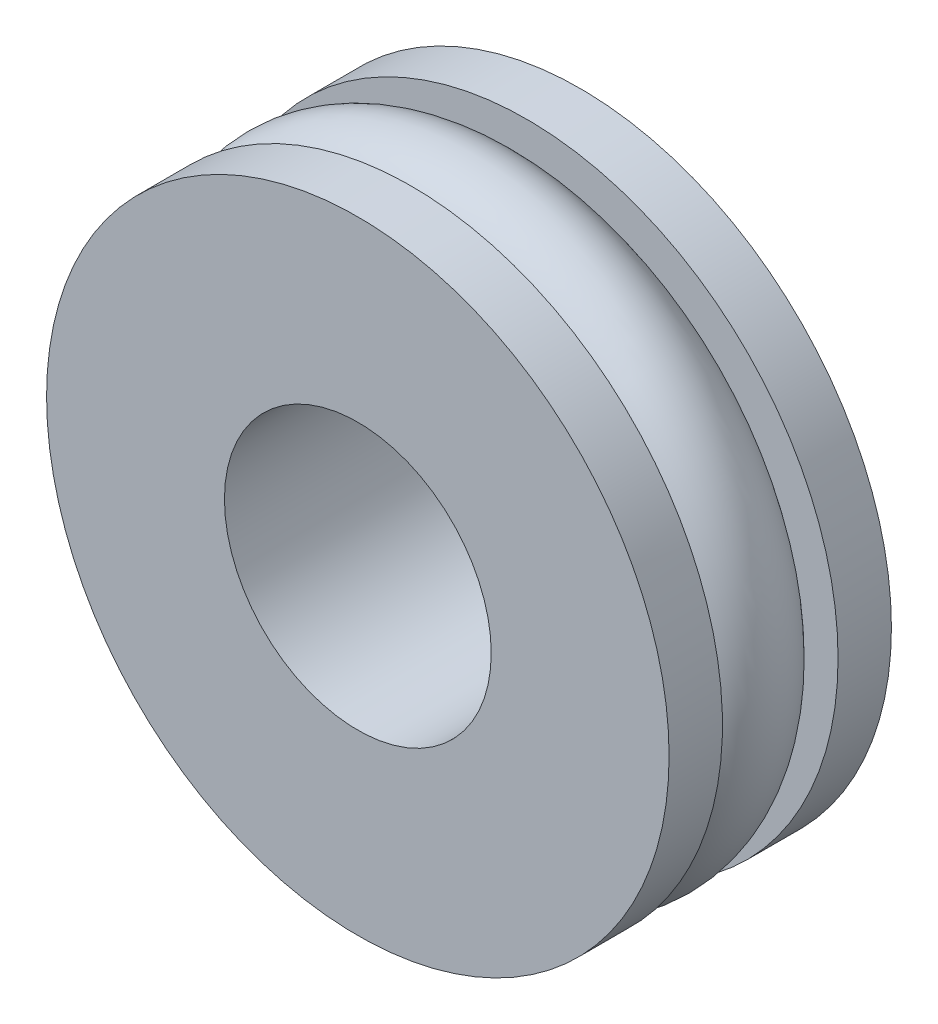
ISO-10303-21;
HEADER;
FILE_DESCRIPTION(('STEP AP214'),'2;1');
FILE_NAME('part.step','',(''),(''),'','','');
FILE_SCHEMA(('AUTOMOTIVE_DESIGN { 1 0 10303 214 1 1 1 1 }'));
ENDSEC;
DATA;
#1=APPLICATION_CONTEXT('core data for automotive mechanical design processes');
#2=APPLICATION_PROTOCOL_DEFINITION('international standard','automotive_design',2000,#1);
#3=PRODUCT_CONTEXT('',#1,'mechanical');
#4=PRODUCT('Part','Part','',(#3));
#5=PRODUCT_RELATED_PRODUCT_CATEGORY('part','',(#4));
#6=PRODUCT_DEFINITION_FORMATION('','',#4);
#7=PRODUCT_DEFINITION_CONTEXT('part definition',#1,'design');
#8=PRODUCT_DEFINITION('design','',#6,#7);
#9=PRODUCT_DEFINITION_SHAPE('','',#8);
#10=(LENGTH_UNIT() NAMED_UNIT(*) SI_UNIT(.MILLI.,.METRE.));
#11=(NAMED_UNIT(*) PLANE_ANGLE_UNIT() SI_UNIT($,.RADIAN.));
#12=(NAMED_UNIT(*) SI_UNIT($,.STERADIAN.) SOLID_ANGLE_UNIT());
#13=UNCERTAINTY_MEASURE_WITH_UNIT(LENGTH_MEASURE(1.E-05),#10,'distance_accuracy_value','');
#14=(GEOMETRIC_REPRESENTATION_CONTEXT(3) GLOBAL_UNCERTAINTY_ASSIGNED_CONTEXT((#13)) GLOBAL_UNIT_ASSIGNED_CONTEXT((#10,
#11,#12)) REPRESENTATION_CONTEXT('',''));
#15=CARTESIAN_POINT('',(0.,0.,0.));
#16=DIRECTION('',(0.,0.,1.));
#17=DIRECTION('',(1.,0.,0.));
#18=AXIS2_PLACEMENT_3D('',#15,#16,#17);
#19=CARTESIAN_POINT('',(0.,0.,5.));
#20=DIRECTION('',(0.,0.,-1.));
#21=DIRECTION('',(-1.,0.,0.));
#22=AXIS2_PLACEMENT_3D('',#19,#20,#21);
#23=CYLINDRICAL_SURFACE('',#22,7.);
#24=CARTESIAN_POINT('',(0.,0.,5.));
#25=DIRECTION('',(0.,0.,1.));
#26=DIRECTION('',(1.,0.,0.));
#27=AXIS2_PLACEMENT_3D('',#24,#25,#26);
#28=CIRCLE('',#27,7.);
#29=CARTESIAN_POINT('',(7.,0.,5.));
#30=VERTEX_POINT('',#29);
#31=EDGE_CURVE('E10',#30,#30,#28,.T.);
#32=ORIENTED_EDGE('',*,*,#31,.F.);
#33=EDGE_LOOP('',(#32));
#34=FACE_BOUND('',#33,.T.);
#35=CARTESIAN_POINT('',(0.,0.,3.8));
#36=DIRECTION('',(0.,0.,-1.));
#37=DIRECTION('',(-1.,0.,0.));
#38=AXIS2_PLACEMENT_3D('',#35,#36,#37);
#39=CIRCLE('',#38,7.);
#40=CARTESIAN_POINT('',(-7.,0.,3.8));
#41=VERTEX_POINT('',#40);
#42=EDGE_CURVE('E43',#41,#41,#39,.T.);
#43=ORIENTED_EDGE('',*,*,#42,.F.);
#44=EDGE_LOOP('',(#43));
#45=FACE_BOUND('',#44,.T.);
#46=ADVANCED_FACE('F40',(#34,#45),#23,.T.);
#47=CARTESIAN_POINT('',(0.,0.,0.));
#48=DIRECTION('',(0.,0.,1.));
#49=DIRECTION('',(1.,0.,0.));
#50=AXIS2_PLACEMENT_3D('',#47,#48,#49);
#51=CIRCLE('',#50,7.);
#52=CARTESIAN_POINT('',(7.,0.,0.));
#53=VERTEX_POINT('',#52);
#54=EDGE_CURVE('E47',#53,#53,#51,.T.);
#55=ORIENTED_EDGE('',*,*,#54,.T.);
#56=EDGE_LOOP('',(#55));
#57=FACE_BOUND('',#56,.T.);
#58=CARTESIAN_POINT('',(0.,0.,1.2));
#59=DIRECTION('',(0.,0.,1.));
#60=DIRECTION('',(1.,0.,0.));
#61=AXIS2_PLACEMENT_3D('',#58,#59,#60);
#62=CIRCLE('',#61,7.);
#63=CARTESIAN_POINT('',(7.,0.,1.2));
#64=VERTEX_POINT('',#63);
#65=EDGE_CURVE('E57',#64,#64,#62,.T.);
#66=ORIENTED_EDGE('',*,*,#65,.F.);
#67=EDGE_LOOP('',(#66));
#68=FACE_BOUND('',#67,.T.);
#69=ADVANCED_FACE('F93',(#57,#68),#23,.T.);
#70=CARTESIAN_POINT('',(0.,0.,5.));
#71=DIRECTION('',(0.,0.,1.));
#72=DIRECTION('',(1.,0.,0.));
#73=AXIS2_PLACEMENT_3D('',#70,#71,#72);
#74=PLANE('',#73);
#75=ORIENTED_EDGE('',*,*,#31,.T.);
#76=EDGE_LOOP('',(#75));
#77=FACE_BOUND('',#76,.T.);
#78=CARTESIAN_POINT('',(0.,0.,5.));
#79=DIRECTION('',(0.,0.,1.));
#80=DIRECTION('',(1.,0.,0.));
#81=AXIS2_PLACEMENT_3D('',#78,#79,#80);
#82=CIRCLE('',#81,3.);
#83=CARTESIAN_POINT('',(3.,0.,5.));
#84=VERTEX_POINT('',#83);
#85=EDGE_CURVE('E52',#84,#84,#82,.T.);
#86=ORIENTED_EDGE('',*,*,#85,.F.);
#87=EDGE_LOOP('',(#86));
#88=FACE_BOUND('',#87,.T.);
#89=ADVANCED_FACE('F89',(#77,#88),#74,.T.);
#90=CARTESIAN_POINT('',(0.,0.,0.));
#91=DIRECTION('',(0.,0.,1.));
#92=DIRECTION('',(1.,0.,0.));
#93=AXIS2_PLACEMENT_3D('',#90,#91,#92);
#94=PLANE('',#93);
#95=ORIENTED_EDGE('',*,*,#54,.F.);
#96=EDGE_LOOP('',(#95));
#97=FACE_BOUND('',#96,.T.);
#98=CARTESIAN_POINT('',(0.,0.,0.));
#99=DIRECTION('',(0.,0.,1.));
#100=DIRECTION('',(1.,0.,0.));
#101=AXIS2_PLACEMENT_3D('',#98,#99,#100);
#102=CIRCLE('',#101,3.);
#103=CARTESIAN_POINT('',(3.,0.,0.));
#104=VERTEX_POINT('',#103);
#105=EDGE_CURVE('E55',#104,#104,#102,.T.);
#106=ORIENTED_EDGE('',*,*,#105,.T.);
#107=EDGE_LOOP('',(#106));
#108=FACE_BOUND('',#107,.T.);
#109=ADVANCED_FACE('F76',(#97,#108),#94,.F.);
#110=CARTESIAN_POINT('',(0.,0.,5.));
#111=DIRECTION('',(0.,0.,-1.));
#112=DIRECTION('',(-1.,0.,0.));
#113=AXIS2_PLACEMENT_3D('',#110,#111,#112);
#114=CYLINDRICAL_SURFACE('',#113,3.);
#115=ORIENTED_EDGE('',*,*,#85,.T.);
#116=EDGE_LOOP('',(#115));
#117=FACE_BOUND('',#116,.T.);
#118=ORIENTED_EDGE('',*,*,#105,.F.);
#119=EDGE_LOOP('',(#118));
#120=FACE_BOUND('',#119,.T.);
#121=ADVANCED_FACE('F78',(#117,#120),#114,.F.);
#122=CARTESIAN_POINT('',(7.90966287822662,0.,3.8));
#123=DIRECTION('',(0.,0.,-1.));
#124=DIRECTION('',(-1.,0.,0.));
#125=AXIS2_PLACEMENT_3D('',#122,#123,#124);
#126=PLANE('',#125);
#127=CARTESIAN_POINT('',(0.,0.,3.8));
#128=DIRECTION('',(0.,0.,1.));
#129=DIRECTION('',(1.,0.,0.));
#130=AXIS2_PLACEMENT_3D('',#127,#128,#129);
#131=CIRCLE('',#130,5.7);
#132=CARTESIAN_POINT('',(5.7,0.,3.8));
#133=VERTEX_POINT('',#132);
#134=EDGE_CURVE('E64',#133,#133,#131,.T.);
#135=ORIENTED_EDGE('',*,*,#134,.T.);
#136=EDGE_LOOP('',(#135));
#137=FACE_BOUND('',#136,.T.);
#138=ORIENTED_EDGE('',*,*,#42,.T.);
#139=EDGE_LOOP('',(#138));
#140=FACE_BOUND('',#139,.T.);
#141=ADVANCED_FACE('F80',(#137,#140),#126,.T.);
#142=CARTESIAN_POINT('',(5.7,0.,1.2));
#143=DIRECTION('',(0.,0.,1.));
#144=DIRECTION('',(1.,0.,0.));
#145=AXIS2_PLACEMENT_3D('',#142,#143,#144);
#146=PLANE('',#145);
#147=CARTESIAN_POINT('',(0.,0.,1.2));
#148=DIRECTION('',(0.,0.,1.));
#149=DIRECTION('',(1.,0.,0.));
#150=AXIS2_PLACEMENT_3D('',#147,#148,#149);
#151=CIRCLE('',#150,5.7);
#152=CARTESIAN_POINT('',(5.7,0.,1.2));
#153=VERTEX_POINT('',#152);
#154=EDGE_CURVE('E59',#153,#153,#151,.T.);
#155=ORIENTED_EDGE('',*,*,#154,.F.);
#156=EDGE_LOOP('',(#155));
#157=FACE_BOUND('',#156,.T.);
#158=ORIENTED_EDGE('',*,*,#65,.T.);
#159=EDGE_LOOP('',(#158));
#160=FACE_BOUND('',#159,.T.);
#161=ADVANCED_FACE('F86',(#157,#160),#146,.T.);
#162=CARTESIAN_POINT('',(0.,0.,2.5));
#163=DIRECTION('',(0.,0.,1.));
#164=DIRECTION('',(1.,0.,0.));
#165=AXIS2_PLACEMENT_3D('',#162,#163,#164);
#166=TOROIDAL_SURFACE('',#165,5.7,1.3);
#167=ORIENTED_EDGE('',*,*,#134,.F.);
#168=EDGE_LOOP('',(#167));
#169=FACE_BOUND('',#168,.T.);
#170=ORIENTED_EDGE('',*,*,#154,.T.);
#171=EDGE_LOOP('',(#170));
#172=FACE_BOUND('',#171,.T.);
#173=ADVANCED_FACE('F144',(#169,#172),#166,.T.);
#174=CLOSED_SHELL('',(#46,#69,#89,#109,#121,#141,#161,#173));
#175=MANIFOLD_SOLID_BREP('B2',#174);
#176=ADVANCED_BREP_SHAPE_REPRESENTATION('',(#18,#175),#14);
#177=SHAPE_DEFINITION_REPRESENTATION(#9,#176);
ENDSEC;
END-ISO-10303-21;
